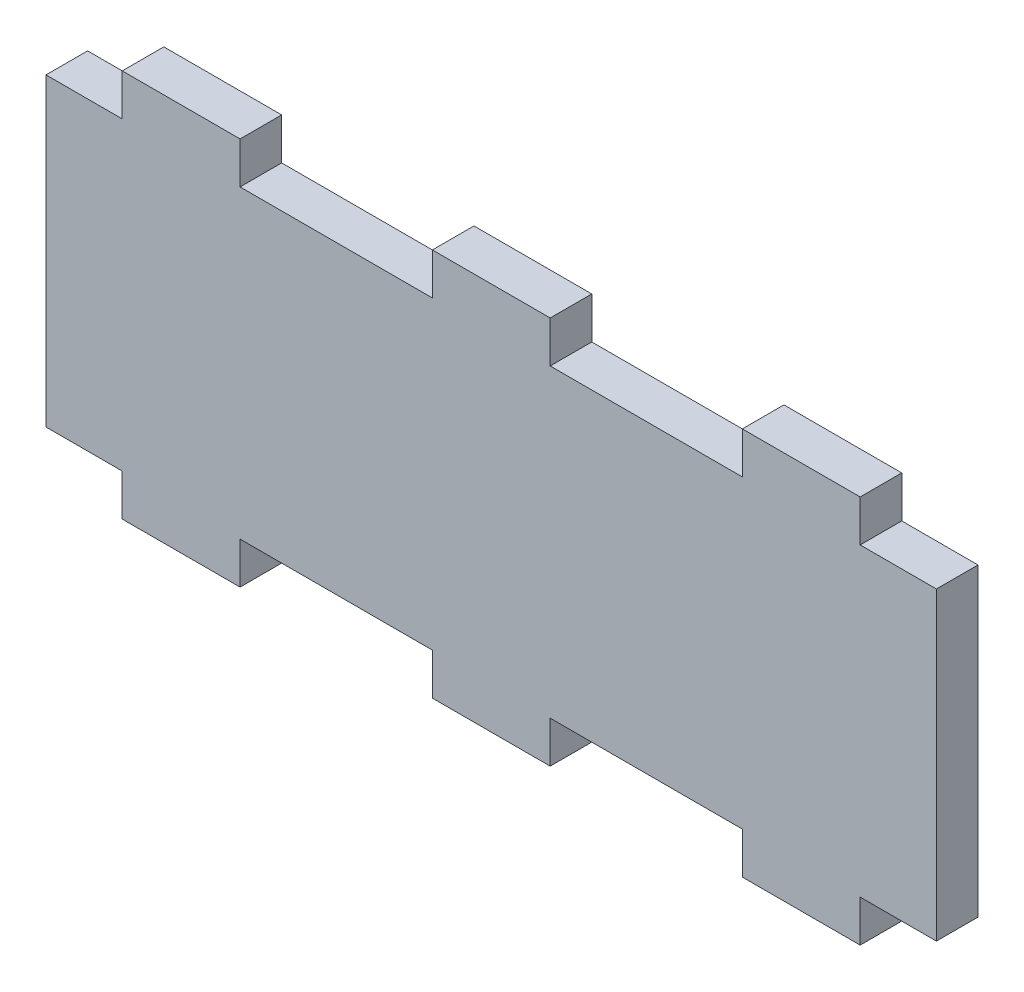
ISO-10303-21;
HEADER;
FILE_DESCRIPTION(('STEP AP214'),'2;1');
FILE_NAME('part.step','',(''),(''),'','','');
FILE_SCHEMA(('AUTOMOTIVE_DESIGN { 1 0 10303 214 1 1 1 1 }'));
ENDSEC;
DATA;
#1=APPLICATION_CONTEXT('core data for automotive mechanical design processes');
#2=APPLICATION_PROTOCOL_DEFINITION('international standard','automotive_design',2000,#1);
#3=PRODUCT_CONTEXT('',#1,'mechanical');
#4=PRODUCT('Part','Part','',(#3));
#5=PRODUCT_RELATED_PRODUCT_CATEGORY('part','',(#4));
#6=PRODUCT_DEFINITION_FORMATION('','',#4);
#7=PRODUCT_DEFINITION_CONTEXT('part definition',#1,'design');
#8=PRODUCT_DEFINITION('design','',#6,#7);
#9=PRODUCT_DEFINITION_SHAPE('','',#8);
#10=(LENGTH_UNIT() NAMED_UNIT(*) SI_UNIT(.MILLI.,.METRE.));
#11=(NAMED_UNIT(*) PLANE_ANGLE_UNIT() SI_UNIT($,.RADIAN.));
#12=(NAMED_UNIT(*) SI_UNIT($,.STERADIAN.) SOLID_ANGLE_UNIT());
#13=UNCERTAINTY_MEASURE_WITH_UNIT(LENGTH_MEASURE(1.E-05),#10,'distance_accuracy_value','');
#14=(GEOMETRIC_REPRESENTATION_CONTEXT(3) GLOBAL_UNCERTAINTY_ASSIGNED_CONTEXT((#13)) GLOBAL_UNIT_ASSIGNED_CONTEXT((#10,
#11,#12)) REPRESENTATION_CONTEXT('',''));
#15=CARTESIAN_POINT('',(0.,0.,0.));
#16=DIRECTION('',(0.,0.,1.));
#17=DIRECTION('',(1.,0.,0.));
#18=AXIS2_PLACEMENT_3D('',#15,#16,#17);
#19=CARTESIAN_POINT('',(8.5,0.,3.));
#20=DIRECTION('',(1.,0.,0.));
#21=DIRECTION('',(0.,0.,-1.));
#22=AXIS2_PLACEMENT_3D('',#19,#20,#21);
#23=PLANE('',#22);
#24=DIRECTION('',(0.,-1.,0.));
#25=VECTOR('',#24,1.);
#26=CARTESIAN_POINT('',(8.5,0.,0.));
#27=LINE('',#26,#25);
#28=CARTESIAN_POINT('',(8.5,0.,0.));
#29=VERTEX_POINT('',#28);
#30=CARTESIAN_POINT('',(8.5,-3.,0.));
#31=VERTEX_POINT('',#30);
#32=EDGE_CURVE('E260',#29,#31,#27,.T.);
#33=ORIENTED_EDGE('',*,*,#32,.T.);
#34=DIRECTION('',(0.,0.,-1.));
#35=VECTOR('',#34,1.);
#36=CARTESIAN_POINT('',(8.5,-3.,3.));
#37=LINE('',#36,#35);
#38=CARTESIAN_POINT('',(8.5,-3.,3.));
#39=VERTEX_POINT('',#38);
#40=EDGE_CURVE('E11',#39,#31,#37,.T.);
#41=ORIENTED_EDGE('',*,*,#40,.F.);
#42=DIRECTION('',(0.,-1.,0.));
#43=VECTOR('',#42,1.);
#44=CARTESIAN_POINT('',(8.5,0.,3.));
#45=LINE('',#44,#43);
#46=CARTESIAN_POINT('',(8.5,0.,3.));
#47=VERTEX_POINT('',#46);
#48=EDGE_CURVE('E342',#47,#39,#45,.T.);
#49=ORIENTED_EDGE('',*,*,#48,.F.);
#50=DIRECTION('',(0.,0.,-1.));
#51=VECTOR('',#50,1.);
#52=CARTESIAN_POINT('',(8.5,0.,3.));
#53=LINE('',#52,#51);
#54=EDGE_CURVE('E256',#47,#29,#53,.T.);
#55=ORIENTED_EDGE('',*,*,#54,.T.);
#56=EDGE_LOOP('',(#33,#41,#49,#55));
#57=FACE_BOUND('',#56,.T.);
#58=ADVANCED_FACE('F39',(#57),#23,.F.);
#59=CARTESIAN_POINT('',(8.5,-3.,3.));
#60=DIRECTION('',(0.,1.,0.));
#61=DIRECTION('',(-1.,0.,0.));
#62=AXIS2_PLACEMENT_3D('',#59,#60,#61);
#63=PLANE('',#62);
#64=DIRECTION('',(1.,0.,0.));
#65=VECTOR('',#64,1.);
#66=CARTESIAN_POINT('',(8.5,-3.,0.));
#67=LINE('',#66,#65);
#68=CARTESIAN_POINT('',(17.,-3.,0.));
#69=VERTEX_POINT('',#68);
#70=EDGE_CURVE('E264',#31,#69,#67,.T.);
#71=ORIENTED_EDGE('',*,*,#70,.T.);
#72=DIRECTION('',(0.,0.,-1.));
#73=VECTOR('',#72,1.);
#74=CARTESIAN_POINT('',(17.,-3.,3.));
#75=LINE('',#74,#73);
#76=CARTESIAN_POINT('',(17.,-3.,3.));
#77=VERTEX_POINT('',#76);
#78=EDGE_CURVE('E48',#77,#69,#75,.T.);
#79=ORIENTED_EDGE('',*,*,#78,.F.);
#80=DIRECTION('',(1.,0.,0.));
#81=VECTOR('',#80,1.);
#82=CARTESIAN_POINT('',(8.5,-3.,3.));
#83=LINE('',#82,#81);
#84=EDGE_CURVE('E159',#39,#77,#83,.T.);
#85=ORIENTED_EDGE('',*,*,#84,.F.);
#86=ORIENTED_EDGE('',*,*,#40,.T.);
#87=EDGE_LOOP('',(#71,#79,#85,#86));
#88=FACE_BOUND('',#87,.T.);
#89=ADVANCED_FACE('F548',(#88),#63,.F.);
#90=CARTESIAN_POINT('',(17.,0.,3.));
#91=DIRECTION('',(-1.,0.,0.));
#92=DIRECTION('',(0.,0.,1.));
#93=AXIS2_PLACEMENT_3D('',#90,#91,#92);
#94=PLANE('',#93);
#95=DIRECTION('',(0.,1.,0.));
#96=VECTOR('',#95,1.);
#97=CARTESIAN_POINT('',(17.,0.,0.));
#98=LINE('',#97,#96);
#99=CARTESIAN_POINT('',(17.,0.,0.));
#100=VERTEX_POINT('',#99);
#101=EDGE_CURVE('E267',#69,#100,#98,.T.);
#102=ORIENTED_EDGE('',*,*,#101,.T.);
#103=DIRECTION('',(0.,0.,-1.));
#104=VECTOR('',#103,1.);
#105=CARTESIAN_POINT('',(17.,0.,3.));
#106=LINE('',#105,#104);
#107=CARTESIAN_POINT('',(17.,0.,3.));
#108=VERTEX_POINT('',#107);
#109=EDGE_CURVE('E433',#108,#100,#106,.T.);
#110=ORIENTED_EDGE('',*,*,#109,.F.);
#111=DIRECTION('',(0.,1.,0.));
#112=VECTOR('',#111,1.);
#113=CARTESIAN_POINT('',(17.,0.,3.));
#114=LINE('',#113,#112);
#115=EDGE_CURVE('E443',#77,#108,#114,.T.);
#116=ORIENTED_EDGE('',*,*,#115,.F.);
#117=ORIENTED_EDGE('',*,*,#78,.T.);
#118=EDGE_LOOP('',(#102,#110,#116,#117));
#119=FACE_BOUND('',#118,.T.);
#120=ADVANCED_FACE('F441',(#119),#94,.F.);
#121=CARTESIAN_POINT('',(17.,0.,3.));
#122=DIRECTION('',(0.,1.,0.));
#123=DIRECTION('',(0.,0.,1.));
#124=AXIS2_PLACEMENT_3D('',#121,#122,#123);
#125=PLANE('',#124);
#126=DIRECTION('',(1.,0.,0.));
#127=VECTOR('',#126,1.);
#128=CARTESIAN_POINT('',(17.,0.,0.));
#129=LINE('',#128,#127);
#130=CARTESIAN_POINT('',(30.87,0.,0.));
#131=VERTEX_POINT('',#130);
#132=EDGE_CURVE('E270',#100,#131,#129,.T.);
#133=ORIENTED_EDGE('',*,*,#132,.T.);
#134=DIRECTION('',(0.,0.,-1.));
#135=VECTOR('',#134,1.);
#136=CARTESIAN_POINT('',(30.87,0.,3.));
#137=LINE('',#136,#135);
#138=CARTESIAN_POINT('',(30.87,0.,3.));
#139=VERTEX_POINT('',#138);
#140=EDGE_CURVE('E429',#139,#131,#137,.T.);
#141=ORIENTED_EDGE('',*,*,#140,.F.);
#142=DIRECTION('',(1.,0.,0.));
#143=VECTOR('',#142,1.);
#144=CARTESIAN_POINT('',(17.,0.,3.));
#145=LINE('',#144,#143);
#146=EDGE_CURVE('E462',#108,#139,#145,.T.);
#147=ORIENTED_EDGE('',*,*,#146,.F.);
#148=ORIENTED_EDGE('',*,*,#109,.T.);
#149=EDGE_LOOP('',(#133,#141,#147,#148));
#150=FACE_BOUND('',#149,.T.);
#151=ADVANCED_FACE('F452',(#150),#125,.F.);
#152=CARTESIAN_POINT('',(30.87,0.,3.));
#153=DIRECTION('',(1.,0.,0.));
#154=DIRECTION('',(0.,0.,-1.));
#155=AXIS2_PLACEMENT_3D('',#152,#153,#154);
#156=PLANE('',#155);
#157=DIRECTION('',(0.,-1.,0.));
#158=VECTOR('',#157,1.);
#159=CARTESIAN_POINT('',(30.87,0.,0.));
#160=LINE('',#159,#158);
#161=CARTESIAN_POINT('',(30.87,-3.,0.));
#162=VERTEX_POINT('',#161);
#163=EDGE_CURVE('E273',#131,#162,#160,.T.);
#164=ORIENTED_EDGE('',*,*,#163,.T.);
#165=DIRECTION('',(0.,0.,-1.));
#166=VECTOR('',#165,1.);
#167=CARTESIAN_POINT('',(30.87,-3.,3.));
#168=LINE('',#167,#166);
#169=CARTESIAN_POINT('',(30.87,-3.,3.));
#170=VERTEX_POINT('',#169);
#171=EDGE_CURVE('E425',#170,#162,#168,.T.);
#172=ORIENTED_EDGE('',*,*,#171,.F.);
#173=DIRECTION('',(0.,-1.,0.));
#174=VECTOR('',#173,1.);
#175=CARTESIAN_POINT('',(30.87,0.,3.));
#176=LINE('',#175,#174);
#177=EDGE_CURVE('E458',#139,#170,#176,.T.);
#178=ORIENTED_EDGE('',*,*,#177,.F.);
#179=ORIENTED_EDGE('',*,*,#140,.T.);
#180=EDGE_LOOP('',(#164,#172,#178,#179));
#181=FACE_BOUND('',#180,.T.);
#182=ADVANCED_FACE('F456',(#181),#156,.F.);
#183=CARTESIAN_POINT('',(30.87,-3.,3.));
#184=DIRECTION('',(0.,1.,0.));
#185=DIRECTION('',(-1.,0.,0.));
#186=AXIS2_PLACEMENT_3D('',#183,#184,#185);
#187=PLANE('',#186);
#188=DIRECTION('',(1.,0.,0.));
#189=VECTOR('',#188,1.);
#190=CARTESIAN_POINT('',(30.87,-3.,0.));
#191=LINE('',#190,#189);
#192=CARTESIAN_POINT('',(39.37,-3.,0.));
#193=VERTEX_POINT('',#192);
#194=EDGE_CURVE('E276',#162,#193,#191,.T.);
#195=ORIENTED_EDGE('',*,*,#194,.T.);
#196=DIRECTION('',(0.,0.,-1.));
#197=VECTOR('',#196,1.);
#198=CARTESIAN_POINT('',(39.37,-3.,3.));
#199=LINE('',#198,#197);
#200=CARTESIAN_POINT('',(39.37,-3.,3.));
#201=VERTEX_POINT('',#200);
#202=EDGE_CURVE('E421',#201,#193,#199,.T.);
#203=ORIENTED_EDGE('',*,*,#202,.F.);
#204=DIRECTION('',(1.,0.,0.));
#205=VECTOR('',#204,1.);
#206=CARTESIAN_POINT('',(30.87,-3.,3.));
#207=LINE('',#206,#205);
#208=EDGE_CURVE('E461',#170,#201,#207,.T.);
#209=ORIENTED_EDGE('',*,*,#208,.F.);
#210=ORIENTED_EDGE('',*,*,#171,.T.);
#211=EDGE_LOOP('',(#195,#203,#209,#210));
#212=FACE_BOUND('',#211,.T.);
#213=ADVANCED_FACE('F561',(#212),#187,.F.);
#214=CARTESIAN_POINT('',(39.37,0.,3.));
#215=DIRECTION('',(-1.,0.,0.));
#216=DIRECTION('',(0.,0.,1.));
#217=AXIS2_PLACEMENT_3D('',#214,#215,#216);
#218=PLANE('',#217);
#219=DIRECTION('',(0.,1.,0.));
#220=VECTOR('',#219,1.);
#221=CARTESIAN_POINT('',(39.37,0.,0.));
#222=LINE('',#221,#220);
#223=CARTESIAN_POINT('',(39.37,0.,0.));
#224=VERTEX_POINT('',#223);
#225=EDGE_CURVE('E279',#193,#224,#222,.T.);
#226=ORIENTED_EDGE('',*,*,#225,.T.);
#227=DIRECTION('',(0.,0.,-1.));
#228=VECTOR('',#227,1.);
#229=CARTESIAN_POINT('',(39.37,0.,3.));
#230=LINE('',#229,#228);
#231=CARTESIAN_POINT('',(39.37,0.,3.));
#232=VERTEX_POINT('',#231);
#233=EDGE_CURVE('E417',#232,#224,#230,.T.);
#234=ORIENTED_EDGE('',*,*,#233,.F.);
#235=DIRECTION('',(0.,1.,0.));
#236=VECTOR('',#235,1.);
#237=CARTESIAN_POINT('',(39.37,0.,3.));
#238=LINE('',#237,#236);
#239=EDGE_CURVE('E466',#201,#232,#238,.T.);
#240=ORIENTED_EDGE('',*,*,#239,.F.);
#241=ORIENTED_EDGE('',*,*,#202,.T.);
#242=EDGE_LOOP('',(#226,#234,#240,#241));
#243=FACE_BOUND('',#242,.T.);
#244=ADVANCED_FACE('F564',(#243),#218,.F.);
#245=CARTESIAN_POINT('',(39.37,0.,3.));
#246=DIRECTION('',(0.,1.,0.));
#247=DIRECTION('',(0.,0.,1.));
#248=AXIS2_PLACEMENT_3D('',#245,#246,#247);
#249=PLANE('',#248);
#250=DIRECTION('',(1.,0.,0.));
#251=VECTOR('',#250,1.);
#252=CARTESIAN_POINT('',(39.37,0.,0.));
#253=LINE('',#252,#251);
#254=CARTESIAN_POINT('',(53.23,0.,0.));
#255=VERTEX_POINT('',#254);
#256=EDGE_CURVE('E282',#224,#255,#253,.T.);
#257=ORIENTED_EDGE('',*,*,#256,.T.);
#258=DIRECTION('',(0.,0.,-1.));
#259=VECTOR('',#258,1.);
#260=CARTESIAN_POINT('',(53.23,0.,3.));
#261=LINE('',#260,#259);
#262=CARTESIAN_POINT('',(53.23,0.,3.));
#263=VERTEX_POINT('',#262);
#264=EDGE_CURVE('E413',#263,#255,#261,.T.);
#265=ORIENTED_EDGE('',*,*,#264,.F.);
#266=DIRECTION('',(1.,0.,0.));
#267=VECTOR('',#266,1.);
#268=CARTESIAN_POINT('',(39.37,0.,3.));
#269=LINE('',#268,#267);
#270=EDGE_CURVE('E473',#232,#263,#269,.T.);
#271=ORIENTED_EDGE('',*,*,#270,.F.);
#272=ORIENTED_EDGE('',*,*,#233,.T.);
#273=EDGE_LOOP('',(#257,#265,#271,#272));
#274=FACE_BOUND('',#273,.T.);
#275=ADVANCED_FACE('F568',(#274),#249,.F.);
#276=CARTESIAN_POINT('',(53.23,0.,3.));
#277=DIRECTION('',(1.,0.,0.));
#278=DIRECTION('',(0.,0.,-1.));
#279=AXIS2_PLACEMENT_3D('',#276,#277,#278);
#280=PLANE('',#279);
#281=DIRECTION('',(0.,-1.,0.));
#282=VECTOR('',#281,1.);
#283=CARTESIAN_POINT('',(53.23,0.,0.));
#284=LINE('',#283,#282);
#285=CARTESIAN_POINT('',(53.23,-3.,0.));
#286=VERTEX_POINT('',#285);
#287=EDGE_CURVE('E285',#255,#286,#284,.T.);
#288=ORIENTED_EDGE('',*,*,#287,.T.);
#289=DIRECTION('',(0.,0.,-1.));
#290=VECTOR('',#289,1.);
#291=CARTESIAN_POINT('',(53.23,-3.,3.));
#292=LINE('',#291,#290);
#293=CARTESIAN_POINT('',(53.23,-3.,3.));
#294=VERTEX_POINT('',#293);
#295=EDGE_CURVE('E409',#294,#286,#292,.T.);
#296=ORIENTED_EDGE('',*,*,#295,.F.);
#297=DIRECTION('',(0.,-1.,0.));
#298=VECTOR('',#297,1.);
#299=CARTESIAN_POINT('',(53.23,0.,3.));
#300=LINE('',#299,#298);
#301=EDGE_CURVE('E476',#263,#294,#300,.T.);
#302=ORIENTED_EDGE('',*,*,#301,.F.);
#303=ORIENTED_EDGE('',*,*,#264,.T.);
#304=EDGE_LOOP('',(#288,#296,#302,#303));
#305=FACE_BOUND('',#304,.T.);
#306=ADVANCED_FACE('F572',(#305),#280,.F.);
#307=CARTESIAN_POINT('',(53.23,-3.,3.));
#308=DIRECTION('',(0.,1.,0.));
#309=DIRECTION('',(0.,0.,1.));
#310=AXIS2_PLACEMENT_3D('',#307,#308,#309);
#311=PLANE('',#310);
#312=DIRECTION('',(1.,0.,0.));
#313=VECTOR('',#312,1.);
#314=CARTESIAN_POINT('',(53.23,-3.,0.));
#315=LINE('',#314,#313);
#316=CARTESIAN_POINT('',(61.73,-3.,0.));
#317=VERTEX_POINT('',#316);
#318=EDGE_CURVE('E288',#286,#317,#315,.T.);
#319=ORIENTED_EDGE('',*,*,#318,.T.);
#320=DIRECTION('',(0.,0.,-1.));
#321=VECTOR('',#320,1.);
#322=CARTESIAN_POINT('',(61.73,-3.,3.));
#323=LINE('',#322,#321);
#324=CARTESIAN_POINT('',(61.73,-3.,3.));
#325=VERTEX_POINT('',#324);
#326=EDGE_CURVE('E405',#325,#317,#323,.T.);
#327=ORIENTED_EDGE('',*,*,#326,.F.);
#328=DIRECTION('',(1.,0.,0.));
#329=VECTOR('',#328,1.);
#330=CARTESIAN_POINT('',(53.23,-3.,3.));
#331=LINE('',#330,#329);
#332=EDGE_CURVE('E479',#294,#325,#331,.T.);
#333=ORIENTED_EDGE('',*,*,#332,.F.);
#334=ORIENTED_EDGE('',*,*,#295,.T.);
#335=EDGE_LOOP('',(#319,#327,#333,#334));
#336=FACE_BOUND('',#335,.T.);
#337=ADVANCED_FACE('F576',(#336),#311,.F.);
#338=CARTESIAN_POINT('',(61.73,0.,3.));
#339=DIRECTION('',(-1.,0.,0.));
#340=DIRECTION('',(0.,0.,1.));
#341=AXIS2_PLACEMENT_3D('',#338,#339,#340);
#342=PLANE('',#341);
#343=DIRECTION('',(0.,1.,0.));
#344=VECTOR('',#343,1.);
#345=CARTESIAN_POINT('',(61.73,0.,0.));
#346=LINE('',#345,#344);
#347=CARTESIAN_POINT('',(61.73,0.,0.));
#348=VERTEX_POINT('',#347);
#349=EDGE_CURVE('E291',#317,#348,#346,.T.);
#350=ORIENTED_EDGE('',*,*,#349,.T.);
#351=DIRECTION('',(0.,0.,-1.));
#352=VECTOR('',#351,1.);
#353=CARTESIAN_POINT('',(61.73,0.,3.));
#354=LINE('',#353,#352);
#355=CARTESIAN_POINT('',(61.73,0.,3.));
#356=VERTEX_POINT('',#355);
#357=EDGE_CURVE('E401',#356,#348,#354,.T.);
#358=ORIENTED_EDGE('',*,*,#357,.F.);
#359=DIRECTION('',(0.,1.,0.));
#360=VECTOR('',#359,1.);
#361=CARTESIAN_POINT('',(61.73,0.,3.));
#362=LINE('',#361,#360);
#363=EDGE_CURVE('E482',#325,#356,#362,.T.);
#364=ORIENTED_EDGE('',*,*,#363,.F.);
#365=ORIENTED_EDGE('',*,*,#326,.T.);
#366=EDGE_LOOP('',(#350,#358,#364,#365));
#367=FACE_BOUND('',#366,.T.);
#368=ADVANCED_FACE('F580',(#367),#342,.F.);
#369=CARTESIAN_POINT('',(61.73,0.,3.));
#370=DIRECTION('',(0.,1.,0.));
#371=DIRECTION('',(0.,0.,1.));
#372=AXIS2_PLACEMENT_3D('',#369,#370,#371);
#373=PLANE('',#372);
#374=DIRECTION('',(1.,0.,0.));
#375=VECTOR('',#374,1.);
#376=CARTESIAN_POINT('',(61.73,0.,0.));
#377=LINE('',#376,#375);
#378=CARTESIAN_POINT('',(67.23,0.,0.));
#379=VERTEX_POINT('',#378);
#380=EDGE_CURVE('E294',#348,#379,#377,.T.);
#381=ORIENTED_EDGE('',*,*,#380,.T.);
#382=DIRECTION('',(0.,0.,-1.));
#383=VECTOR('',#382,1.);
#384=CARTESIAN_POINT('',(67.23,0.,3.));
#385=LINE('',#384,#383);
#386=CARTESIAN_POINT('',(67.23,0.,3.));
#387=VERTEX_POINT('',#386);
#388=EDGE_CURVE('E397',#387,#379,#385,.T.);
#389=ORIENTED_EDGE('',*,*,#388,.F.);
#390=DIRECTION('',(1.,0.,0.));
#391=VECTOR('',#390,1.);
#392=CARTESIAN_POINT('',(61.73,0.,3.));
#393=LINE('',#392,#391);
#394=EDGE_CURVE('E485',#356,#387,#393,.T.);
#395=ORIENTED_EDGE('',*,*,#394,.F.);
#396=ORIENTED_EDGE('',*,*,#357,.T.);
#397=EDGE_LOOP('',(#381,#389,#395,#396));
#398=FACE_BOUND('',#397,.T.);
#399=ADVANCED_FACE('F584',(#398),#373,.F.);
#400=CARTESIAN_POINT('',(67.23,22.,3.));
#401=DIRECTION('',(-1.,0.,0.));
#402=DIRECTION('',(0.,0.,1.));
#403=AXIS2_PLACEMENT_3D('',#400,#401,#402);
#404=PLANE('',#403);
#405=DIRECTION('',(0.,1.,0.));
#406=VECTOR('',#405,1.);
#407=CARTESIAN_POINT('',(67.23,22.,0.));
#408=LINE('',#407,#406);
#409=CARTESIAN_POINT('',(67.23,22.,0.));
#410=VERTEX_POINT('',#409);
#411=EDGE_CURVE('E297',#379,#410,#408,.T.);
#412=ORIENTED_EDGE('',*,*,#411,.T.);
#413=DIRECTION('',(0.,0.,-1.));
#414=VECTOR('',#413,1.);
#415=CARTESIAN_POINT('',(67.23,22.,3.));
#416=LINE('',#415,#414);
#417=CARTESIAN_POINT('',(67.23,22.,3.));
#418=VERTEX_POINT('',#417);
#419=EDGE_CURVE('E393',#418,#410,#416,.T.);
#420=ORIENTED_EDGE('',*,*,#419,.F.);
#421=DIRECTION('',(0.,1.,0.));
#422=VECTOR('',#421,1.);
#423=CARTESIAN_POINT('',(67.23,22.,3.));
#424=LINE('',#423,#422);
#425=EDGE_CURVE('E488',#387,#418,#424,.T.);
#426=ORIENTED_EDGE('',*,*,#425,.F.);
#427=ORIENTED_EDGE('',*,*,#388,.T.);
#428=EDGE_LOOP('',(#412,#420,#426,#427));
#429=FACE_BOUND('',#428,.T.);
#430=ADVANCED_FACE('F588',(#429),#404,.F.);
#431=CARTESIAN_POINT('',(61.73,22.,3.));
#432=DIRECTION('',(0.,-1.,0.));
#433=DIRECTION('',(0.,0.,-1.));
#434=AXIS2_PLACEMENT_3D('',#431,#432,#433);
#435=PLANE('',#434);
#436=DIRECTION('',(-1.,0.,0.));
#437=VECTOR('',#436,1.);
#438=CARTESIAN_POINT('',(61.73,22.,0.));
#439=LINE('',#438,#437);
#440=CARTESIAN_POINT('',(61.73,22.,0.));
#441=VERTEX_POINT('',#440);
#442=EDGE_CURVE('E300',#410,#441,#439,.T.);
#443=ORIENTED_EDGE('',*,*,#442,.T.);
#444=DIRECTION('',(0.,0.,-1.));
#445=VECTOR('',#444,1.);
#446=CARTESIAN_POINT('',(61.73,22.,3.));
#447=LINE('',#446,#445);
#448=CARTESIAN_POINT('',(61.73,22.,3.));
#449=VERTEX_POINT('',#448);
#450=EDGE_CURVE('E389',#449,#441,#447,.T.);
#451=ORIENTED_EDGE('',*,*,#450,.F.);
#452=DIRECTION('',(-1.,0.,0.));
#453=VECTOR('',#452,1.);
#454=CARTESIAN_POINT('',(61.73,22.,3.));
#455=LINE('',#454,#453);
#456=EDGE_CURVE('E491',#418,#449,#455,.T.);
#457=ORIENTED_EDGE('',*,*,#456,.F.);
#458=ORIENTED_EDGE('',*,*,#419,.T.);
#459=EDGE_LOOP('',(#443,#451,#457,#458));
#460=FACE_BOUND('',#459,.T.);
#461=ADVANCED_FACE('F592',(#460),#435,.F.);
#462=CARTESIAN_POINT('',(61.73,22.,3.));
#463=DIRECTION('',(-1.,0.,0.));
#464=DIRECTION('',(0.,0.,1.));
#465=AXIS2_PLACEMENT_3D('',#462,#463,#464);
#466=PLANE('',#465);
#467=DIRECTION('',(0.,1.,0.));
#468=VECTOR('',#467,1.);
#469=CARTESIAN_POINT('',(61.73,22.,0.));
#470=LINE('',#469,#468);
#471=CARTESIAN_POINT('',(61.73,25.,0.));
#472=VERTEX_POINT('',#471);
#473=EDGE_CURVE('E303',#441,#472,#470,.T.);
#474=ORIENTED_EDGE('',*,*,#473,.T.);
#475=DIRECTION('',(0.,0.,-1.));
#476=VECTOR('',#475,1.);
#477=CARTESIAN_POINT('',(61.73,25.,3.));
#478=LINE('',#477,#476);
#479=CARTESIAN_POINT('',(61.73,25.,3.));
#480=VERTEX_POINT('',#479);
#481=EDGE_CURVE('E385',#480,#472,#478,.T.);
#482=ORIENTED_EDGE('',*,*,#481,.F.);
#483=DIRECTION('',(0.,1.,0.));
#484=VECTOR('',#483,1.);
#485=CARTESIAN_POINT('',(61.73,22.,3.));
#486=LINE('',#485,#484);
#487=EDGE_CURVE('E494',#449,#480,#486,.T.);
#488=ORIENTED_EDGE('',*,*,#487,.F.);
#489=ORIENTED_EDGE('',*,*,#450,.T.);
#490=EDGE_LOOP('',(#474,#482,#488,#489));
#491=FACE_BOUND('',#490,.T.);
#492=ADVANCED_FACE('F596',(#491),#466,.F.);
#493=CARTESIAN_POINT('',(53.23,25.,3.));
#494=DIRECTION('',(0.,-1.,0.));
#495=DIRECTION('',(0.,0.,-1.));
#496=AXIS2_PLACEMENT_3D('',#493,#494,#495);
#497=PLANE('',#496);
#498=DIRECTION('',(-1.,0.,0.));
#499=VECTOR('',#498,1.);
#500=CARTESIAN_POINT('',(53.23,25.,0.));
#501=LINE('',#500,#499);
#502=CARTESIAN_POINT('',(53.23,25.,0.));
#503=VERTEX_POINT('',#502);
#504=EDGE_CURVE('E306',#472,#503,#501,.T.);
#505=ORIENTED_EDGE('',*,*,#504,.T.);
#506=DIRECTION('',(0.,0.,-1.));
#507=VECTOR('',#506,1.);
#508=CARTESIAN_POINT('',(53.23,25.,3.));
#509=LINE('',#508,#507);
#510=CARTESIAN_POINT('',(53.23,25.,3.));
#511=VERTEX_POINT('',#510);
#512=EDGE_CURVE('E381',#511,#503,#509,.T.);
#513=ORIENTED_EDGE('',*,*,#512,.F.);
#514=DIRECTION('',(-1.,0.,0.));
#515=VECTOR('',#514,1.);
#516=CARTESIAN_POINT('',(53.23,25.,3.));
#517=LINE('',#516,#515);
#518=EDGE_CURVE('E497',#480,#511,#517,.T.);
#519=ORIENTED_EDGE('',*,*,#518,.F.);
#520=ORIENTED_EDGE('',*,*,#481,.T.);
#521=EDGE_LOOP('',(#505,#513,#519,#520));
#522=FACE_BOUND('',#521,.T.);
#523=ADVANCED_FACE('F600',(#522),#497,.F.);
#524=CARTESIAN_POINT('',(53.23,22.,3.));
#525=DIRECTION('',(1.,0.,0.));
#526=DIRECTION('',(0.,0.,-1.));
#527=AXIS2_PLACEMENT_3D('',#524,#525,#526);
#528=PLANE('',#527);
#529=DIRECTION('',(0.,-1.,0.));
#530=VECTOR('',#529,1.);
#531=CARTESIAN_POINT('',(53.23,22.,0.));
#532=LINE('',#531,#530);
#533=CARTESIAN_POINT('',(53.23,22.,0.));
#534=VERTEX_POINT('',#533);
#535=EDGE_CURVE('E309',#503,#534,#532,.T.);
#536=ORIENTED_EDGE('',*,*,#535,.T.);
#537=DIRECTION('',(0.,0.,-1.));
#538=VECTOR('',#537,1.);
#539=CARTESIAN_POINT('',(53.23,22.,3.));
#540=LINE('',#539,#538);
#541=CARTESIAN_POINT('',(53.23,22.,3.));
#542=VERTEX_POINT('',#541);
#543=EDGE_CURVE('E377',#542,#534,#540,.T.);
#544=ORIENTED_EDGE('',*,*,#543,.F.);
#545=DIRECTION('',(0.,-1.,0.));
#546=VECTOR('',#545,1.);
#547=CARTESIAN_POINT('',(53.23,22.,3.));
#548=LINE('',#547,#546);
#549=EDGE_CURVE('E500',#511,#542,#548,.T.);
#550=ORIENTED_EDGE('',*,*,#549,.F.);
#551=ORIENTED_EDGE('',*,*,#512,.T.);
#552=EDGE_LOOP('',(#536,#544,#550,#551));
#553=FACE_BOUND('',#552,.T.);
#554=ADVANCED_FACE('F604',(#553),#528,.F.);
#555=CARTESIAN_POINT('',(39.37,22.,3.));
#556=DIRECTION('',(0.,-1.,0.));
#557=DIRECTION('',(0.,0.,-1.));
#558=AXIS2_PLACEMENT_3D('',#555,#556,#557);
#559=PLANE('',#558);
#560=DIRECTION('',(-1.,0.,0.));
#561=VECTOR('',#560,1.);
#562=CARTESIAN_POINT('',(39.37,22.,0.));
#563=LINE('',#562,#561);
#564=CARTESIAN_POINT('',(39.37,22.,0.));
#565=VERTEX_POINT('',#564);
#566=EDGE_CURVE('E312',#534,#565,#563,.T.);
#567=ORIENTED_EDGE('',*,*,#566,.T.);
#568=DIRECTION('',(0.,0.,-1.));
#569=VECTOR('',#568,1.);
#570=CARTESIAN_POINT('',(39.37,22.,3.));
#571=LINE('',#570,#569);
#572=CARTESIAN_POINT('',(39.37,22.,3.));
#573=VERTEX_POINT('',#572);
#574=EDGE_CURVE('E373',#573,#565,#571,.T.);
#575=ORIENTED_EDGE('',*,*,#574,.F.);
#576=DIRECTION('',(-1.,0.,0.));
#577=VECTOR('',#576,1.);
#578=CARTESIAN_POINT('',(39.37,22.,3.));
#579=LINE('',#578,#577);
#580=EDGE_CURVE('E503',#542,#573,#579,.T.);
#581=ORIENTED_EDGE('',*,*,#580,.F.);
#582=ORIENTED_EDGE('',*,*,#543,.T.);
#583=EDGE_LOOP('',(#567,#575,#581,#582));
#584=FACE_BOUND('',#583,.T.);
#585=ADVANCED_FACE('F608',(#584),#559,.F.);
#586=CARTESIAN_POINT('',(39.37,22.,3.));
#587=DIRECTION('',(-1.,0.,0.));
#588=DIRECTION('',(0.,0.,1.));
#589=AXIS2_PLACEMENT_3D('',#586,#587,#588);
#590=PLANE('',#589);
#591=DIRECTION('',(0.,1.,0.));
#592=VECTOR('',#591,1.);
#593=CARTESIAN_POINT('',(39.37,22.,0.));
#594=LINE('',#593,#592);
#595=CARTESIAN_POINT('',(39.37,25.,0.));
#596=VERTEX_POINT('',#595);
#597=EDGE_CURVE('E315',#565,#596,#594,.T.);
#598=ORIENTED_EDGE('',*,*,#597,.T.);
#599=DIRECTION('',(0.,0.,-1.));
#600=VECTOR('',#599,1.);
#601=CARTESIAN_POINT('',(39.37,25.,3.));
#602=LINE('',#601,#600);
#603=CARTESIAN_POINT('',(39.37,25.,3.));
#604=VERTEX_POINT('',#603);
#605=EDGE_CURVE('E369',#604,#596,#602,.T.);
#606=ORIENTED_EDGE('',*,*,#605,.F.);
#607=DIRECTION('',(0.,1.,0.));
#608=VECTOR('',#607,1.);
#609=CARTESIAN_POINT('',(39.37,22.,3.));
#610=LINE('',#609,#608);
#611=EDGE_CURVE('E506',#573,#604,#610,.T.);
#612=ORIENTED_EDGE('',*,*,#611,.F.);
#613=ORIENTED_EDGE('',*,*,#574,.T.);
#614=EDGE_LOOP('',(#598,#606,#612,#613));
#615=FACE_BOUND('',#614,.T.);
#616=ADVANCED_FACE('F612',(#615),#590,.F.);
#617=CARTESIAN_POINT('',(30.87,25.,3.));
#618=DIRECTION('',(0.,-1.,0.));
#619=DIRECTION('',(1.,0.,0.));
#620=AXIS2_PLACEMENT_3D('',#617,#618,#619);
#621=PLANE('',#620);
#622=DIRECTION('',(-1.,0.,0.));
#623=VECTOR('',#622,1.);
#624=CARTESIAN_POINT('',(30.87,25.,0.));
#625=LINE('',#624,#623);
#626=CARTESIAN_POINT('',(30.87,25.,0.));
#627=VERTEX_POINT('',#626);
#628=EDGE_CURVE('E318',#596,#627,#625,.T.);
#629=ORIENTED_EDGE('',*,*,#628,.T.);
#630=DIRECTION('',(0.,0.,-1.));
#631=VECTOR('',#630,1.);
#632=CARTESIAN_POINT('',(30.87,25.,3.));
#633=LINE('',#632,#631);
#634=CARTESIAN_POINT('',(30.87,25.,3.));
#635=VERTEX_POINT('',#634);
#636=EDGE_CURVE('E365',#635,#627,#633,.T.);
#637=ORIENTED_EDGE('',*,*,#636,.F.);
#638=DIRECTION('',(-1.,0.,0.));
#639=VECTOR('',#638,1.);
#640=CARTESIAN_POINT('',(30.87,25.,3.));
#641=LINE('',#640,#639);
#642=EDGE_CURVE('E509',#604,#635,#641,.T.);
#643=ORIENTED_EDGE('',*,*,#642,.F.);
#644=ORIENTED_EDGE('',*,*,#605,.T.);
#645=EDGE_LOOP('',(#629,#637,#643,#644));
#646=FACE_BOUND('',#645,.T.);
#647=ADVANCED_FACE('F616',(#646),#621,.F.);
#648=CARTESIAN_POINT('',(30.87,22.,3.));
#649=DIRECTION('',(1.,0.,0.));
#650=DIRECTION('',(0.,0.,-1.));
#651=AXIS2_PLACEMENT_3D('',#648,#649,#650);
#652=PLANE('',#651);
#653=DIRECTION('',(0.,-1.,0.));
#654=VECTOR('',#653,1.);
#655=CARTESIAN_POINT('',(30.87,22.,0.));
#656=LINE('',#655,#654);
#657=CARTESIAN_POINT('',(30.87,22.,0.));
#658=VERTEX_POINT('',#657);
#659=EDGE_CURVE('E321',#627,#658,#656,.T.);
#660=ORIENTED_EDGE('',*,*,#659,.T.);
#661=DIRECTION('',(0.,0.,-1.));
#662=VECTOR('',#661,1.);
#663=CARTESIAN_POINT('',(30.87,22.,3.));
#664=LINE('',#663,#662);
#665=CARTESIAN_POINT('',(30.87,22.,3.));
#666=VERTEX_POINT('',#665);
#667=EDGE_CURVE('E361',#666,#658,#664,.T.);
#668=ORIENTED_EDGE('',*,*,#667,.F.);
#669=DIRECTION('',(0.,-1.,0.));
#670=VECTOR('',#669,1.);
#671=CARTESIAN_POINT('',(30.87,22.,3.));
#672=LINE('',#671,#670);
#673=EDGE_CURVE('E512',#635,#666,#672,.T.);
#674=ORIENTED_EDGE('',*,*,#673,.F.);
#675=ORIENTED_EDGE('',*,*,#636,.T.);
#676=EDGE_LOOP('',(#660,#668,#674,#675));
#677=FACE_BOUND('',#676,.T.);
#678=ADVANCED_FACE('F620',(#677),#652,.F.);
#679=CARTESIAN_POINT('',(17.,22.,3.));
#680=DIRECTION('',(0.,-1.,0.));
#681=DIRECTION('',(0.,0.,-1.));
#682=AXIS2_PLACEMENT_3D('',#679,#680,#681);
#683=PLANE('',#682);
#684=DIRECTION('',(-1.,0.,0.));
#685=VECTOR('',#684,1.);
#686=CARTESIAN_POINT('',(17.,22.,0.));
#687=LINE('',#686,#685);
#688=CARTESIAN_POINT('',(17.,22.,0.));
#689=VERTEX_POINT('',#688);
#690=EDGE_CURVE('E324',#658,#689,#687,.T.);
#691=ORIENTED_EDGE('',*,*,#690,.T.);
#692=DIRECTION('',(0.,0.,-1.));
#693=VECTOR('',#692,1.);
#694=CARTESIAN_POINT('',(17.,22.,3.));
#695=LINE('',#694,#693);
#696=CARTESIAN_POINT('',(17.,22.,3.));
#697=VERTEX_POINT('',#696);
#698=EDGE_CURVE('E357',#697,#689,#695,.T.);
#699=ORIENTED_EDGE('',*,*,#698,.F.);
#700=DIRECTION('',(-1.,0.,0.));
#701=VECTOR('',#700,1.);
#702=CARTESIAN_POINT('',(17.,22.,3.));
#703=LINE('',#702,#701);
#704=EDGE_CURVE('E515',#666,#697,#703,.T.);
#705=ORIENTED_EDGE('',*,*,#704,.F.);
#706=ORIENTED_EDGE('',*,*,#667,.T.);
#707=EDGE_LOOP('',(#691,#699,#705,#706));
#708=FACE_BOUND('',#707,.T.);
#709=ADVANCED_FACE('F624',(#708),#683,.F.);
#710=CARTESIAN_POINT('',(17.,22.,3.));
#711=DIRECTION('',(-1.,0.,0.));
#712=DIRECTION('',(0.,0.,1.));
#713=AXIS2_PLACEMENT_3D('',#710,#711,#712);
#714=PLANE('',#713);
#715=DIRECTION('',(0.,1.,0.));
#716=VECTOR('',#715,1.);
#717=CARTESIAN_POINT('',(17.,22.,0.));
#718=LINE('',#717,#716);
#719=CARTESIAN_POINT('',(17.,25.,0.));
#720=VERTEX_POINT('',#719);
#721=EDGE_CURVE('E327',#689,#720,#718,.T.);
#722=ORIENTED_EDGE('',*,*,#721,.T.);
#723=DIRECTION('',(0.,0.,-1.));
#724=VECTOR('',#723,1.);
#725=CARTESIAN_POINT('',(17.,25.,3.));
#726=LINE('',#725,#724);
#727=CARTESIAN_POINT('',(17.,25.,3.));
#728=VERTEX_POINT('',#727);
#729=EDGE_CURVE('E353',#728,#720,#726,.T.);
#730=ORIENTED_EDGE('',*,*,#729,.F.);
#731=DIRECTION('',(0.,1.,0.));
#732=VECTOR('',#731,1.);
#733=CARTESIAN_POINT('',(17.,22.,3.));
#734=LINE('',#733,#732);
#735=EDGE_CURVE('E518',#697,#728,#734,.T.);
#736=ORIENTED_EDGE('',*,*,#735,.F.);
#737=ORIENTED_EDGE('',*,*,#698,.T.);
#738=EDGE_LOOP('',(#722,#730,#736,#737));
#739=FACE_BOUND('',#738,.T.);
#740=ADVANCED_FACE('F628',(#739),#714,.F.);
#741=CARTESIAN_POINT('',(8.5,25.,3.));
#742=DIRECTION('',(0.,-1.,0.));
#743=DIRECTION('',(1.,0.,0.));
#744=AXIS2_PLACEMENT_3D('',#741,#742,#743);
#745=PLANE('',#744);
#746=DIRECTION('',(-1.,0.,0.));
#747=VECTOR('',#746,1.);
#748=CARTESIAN_POINT('',(8.5,25.,0.));
#749=LINE('',#748,#747);
#750=CARTESIAN_POINT('',(8.5,25.,0.));
#751=VERTEX_POINT('',#750);
#752=EDGE_CURVE('E330',#720,#751,#749,.T.);
#753=ORIENTED_EDGE('',*,*,#752,.T.);
#754=DIRECTION('',(0.,0.,-1.));
#755=VECTOR('',#754,1.);
#756=CARTESIAN_POINT('',(8.5,25.,3.));
#757=LINE('',#756,#755);
#758=CARTESIAN_POINT('',(8.5,25.,3.));
#759=VERTEX_POINT('',#758);
#760=EDGE_CURVE('E349',#759,#751,#757,.T.);
#761=ORIENTED_EDGE('',*,*,#760,.F.);
#762=DIRECTION('',(-1.,0.,0.));
#763=VECTOR('',#762,1.);
#764=CARTESIAN_POINT('',(8.5,25.,3.));
#765=LINE('',#764,#763);
#766=EDGE_CURVE('E521',#728,#759,#765,.T.);
#767=ORIENTED_EDGE('',*,*,#766,.F.);
#768=ORIENTED_EDGE('',*,*,#729,.T.);
#769=EDGE_LOOP('',(#753,#761,#767,#768));
#770=FACE_BOUND('',#769,.T.);
#771=ADVANCED_FACE('F529',(#770),#745,.F.);
#772=CARTESIAN_POINT('',(8.5,22.,3.));
#773=DIRECTION('',(1.,0.,0.));
#774=DIRECTION('',(0.,0.,-1.));
#775=AXIS2_PLACEMENT_3D('',#772,#773,#774);
#776=PLANE('',#775);
#777=DIRECTION('',(0.,-1.,0.));
#778=VECTOR('',#777,1.);
#779=CARTESIAN_POINT('',(8.5,22.,0.));
#780=LINE('',#779,#778);
#781=CARTESIAN_POINT('',(8.5,22.,0.));
#782=VERTEX_POINT('',#781);
#783=EDGE_CURVE('E333',#751,#782,#780,.T.);
#784=ORIENTED_EDGE('',*,*,#783,.T.);
#785=DIRECTION('',(0.,0.,-1.));
#786=VECTOR('',#785,1.);
#787=CARTESIAN_POINT('',(8.5,22.,3.));
#788=LINE('',#787,#786);
#789=CARTESIAN_POINT('',(8.5,22.,3.));
#790=VERTEX_POINT('',#789);
#791=EDGE_CURVE('E249',#790,#782,#788,.T.);
#792=ORIENTED_EDGE('',*,*,#791,.F.);
#793=DIRECTION('',(0.,-1.,0.));
#794=VECTOR('',#793,1.);
#795=CARTESIAN_POINT('',(8.5,22.,3.));
#796=LINE('',#795,#794);
#797=EDGE_CURVE('E238',#759,#790,#796,.T.);
#798=ORIENTED_EDGE('',*,*,#797,.F.);
#799=ORIENTED_EDGE('',*,*,#760,.T.);
#800=EDGE_LOOP('',(#784,#792,#798,#799));
#801=FACE_BOUND('',#800,.T.);
#802=ADVANCED_FACE('F533',(#801),#776,.F.);
#803=CARTESIAN_POINT('',(3.,22.,3.));
#804=DIRECTION('',(0.,-1.,0.));
#805=DIRECTION('',(0.,0.,-1.));
#806=AXIS2_PLACEMENT_3D('',#803,#804,#805);
#807=PLANE('',#806);
#808=DIRECTION('',(-1.,0.,0.));
#809=VECTOR('',#808,1.);
#810=CARTESIAN_POINT('',(3.,22.,0.));
#811=LINE('',#810,#809);
#812=CARTESIAN_POINT('',(3.,22.,0.));
#813=VERTEX_POINT('',#812);
#814=EDGE_CURVE('E247',#782,#813,#811,.T.);
#815=ORIENTED_EDGE('',*,*,#814,.T.);
#816=DIRECTION('',(0.,0.,-1.));
#817=VECTOR('',#816,1.);
#818=CARTESIAN_POINT('',(3.,22.,3.));
#819=LINE('',#818,#817);
#820=CARTESIAN_POINT('',(3.,22.,3.));
#821=VERTEX_POINT('',#820);
#822=EDGE_CURVE('E244',#821,#813,#819,.T.);
#823=ORIENTED_EDGE('',*,*,#822,.F.);
#824=DIRECTION('',(-1.,0.,0.));
#825=VECTOR('',#824,1.);
#826=CARTESIAN_POINT('',(3.,22.,3.));
#827=LINE('',#826,#825);
#828=EDGE_CURVE('E232',#790,#821,#827,.T.);
#829=ORIENTED_EDGE('',*,*,#828,.F.);
#830=ORIENTED_EDGE('',*,*,#791,.T.);
#831=EDGE_LOOP('',(#815,#823,#829,#830));
#832=FACE_BOUND('',#831,.T.);
#833=ADVANCED_FACE('F245',(#832),#807,.F.);
#834=CARTESIAN_POINT('',(3.,22.,3.));
#835=DIRECTION('',(1.,0.,0.));
#836=DIRECTION('',(0.,0.,-1.));
#837=AXIS2_PLACEMENT_3D('',#834,#835,#836);
#838=PLANE('',#837);
#839=DIRECTION('',(0.,-1.,0.));
#840=VECTOR('',#839,1.);
#841=CARTESIAN_POINT('',(3.,22.,0.));
#842=LINE('',#841,#840);
#843=CARTESIAN_POINT('',(3.,0.,0.));
#844=VERTEX_POINT('',#843);
#845=EDGE_CURVE('E145',#813,#844,#842,.T.);
#846=ORIENTED_EDGE('',*,*,#845,.T.);
#847=DIRECTION('',(0.,0.,-1.));
#848=VECTOR('',#847,1.);
#849=CARTESIAN_POINT('',(3.,0.,3.));
#850=LINE('',#849,#848);
#851=CARTESIAN_POINT('',(3.,0.,3.));
#852=VERTEX_POINT('',#851);
#853=EDGE_CURVE('E250',#852,#844,#850,.T.);
#854=ORIENTED_EDGE('',*,*,#853,.F.);
#855=DIRECTION('',(0.,-1.,0.));
#856=VECTOR('',#855,1.);
#857=CARTESIAN_POINT('',(3.,22.,3.));
#858=LINE('',#857,#856);
#859=EDGE_CURVE('E236',#821,#852,#858,.T.);
#860=ORIENTED_EDGE('',*,*,#859,.F.);
#861=ORIENTED_EDGE('',*,*,#822,.T.);
#862=EDGE_LOOP('',(#846,#854,#860,#861));
#863=FACE_BOUND('',#862,.T.);
#864=ADVANCED_FACE('F252',(#863),#838,.F.);
#865=CARTESIAN_POINT('',(3.,0.,3.));
#866=DIRECTION('',(0.,1.,0.));
#867=DIRECTION('',(-1.,0.,0.));
#868=AXIS2_PLACEMENT_3D('',#865,#866,#867);
#869=PLANE('',#868);
#870=DIRECTION('',(1.,0.,0.));
#871=VECTOR('',#870,1.);
#872=CARTESIAN_POINT('',(3.,0.,0.));
#873=LINE('',#872,#871);
#874=EDGE_CURVE('E151',#844,#29,#873,.T.);
#875=ORIENTED_EDGE('',*,*,#874,.T.);
#876=ORIENTED_EDGE('',*,*,#54,.F.);
#877=DIRECTION('',(1.,0.,0.));
#878=VECTOR('',#877,1.);
#879=CARTESIAN_POINT('',(3.,0.,3.));
#880=LINE('',#879,#878);
#881=EDGE_CURVE('E56',#852,#47,#880,.T.);
#882=ORIENTED_EDGE('',*,*,#881,.F.);
#883=ORIENTED_EDGE('',*,*,#853,.T.);
#884=EDGE_LOOP('',(#875,#876,#882,#883));
#885=FACE_BOUND('',#884,.T.);
#886=ADVANCED_FACE('F537',(#885),#869,.F.);
#887=CARTESIAN_POINT('',(0.,0.,3.));
#888=DIRECTION('',(0.,0.,1.));
#889=DIRECTION('',(1.,0.,0.));
#890=AXIS2_PLACEMENT_3D('',#887,#888,#889);
#891=PLANE('',#890);
#892=ORIENTED_EDGE('',*,*,#48,.T.);
#893=ORIENTED_EDGE('',*,*,#84,.T.);
#894=ORIENTED_EDGE('',*,*,#115,.T.);
#895=ORIENTED_EDGE('',*,*,#146,.T.);
#896=ORIENTED_EDGE('',*,*,#177,.T.);
#897=ORIENTED_EDGE('',*,*,#208,.T.);
#898=ORIENTED_EDGE('',*,*,#239,.T.);
#899=ORIENTED_EDGE('',*,*,#270,.T.);
#900=ORIENTED_EDGE('',*,*,#301,.T.);
#901=ORIENTED_EDGE('',*,*,#332,.T.);
#902=ORIENTED_EDGE('',*,*,#363,.T.);
#903=ORIENTED_EDGE('',*,*,#394,.T.);
#904=ORIENTED_EDGE('',*,*,#425,.T.);
#905=ORIENTED_EDGE('',*,*,#456,.T.);
#906=ORIENTED_EDGE('',*,*,#487,.T.);
#907=ORIENTED_EDGE('',*,*,#518,.T.);
#908=ORIENTED_EDGE('',*,*,#549,.T.);
#909=ORIENTED_EDGE('',*,*,#580,.T.);
#910=ORIENTED_EDGE('',*,*,#611,.T.);
#911=ORIENTED_EDGE('',*,*,#642,.T.);
#912=ORIENTED_EDGE('',*,*,#673,.T.);
#913=ORIENTED_EDGE('',*,*,#704,.T.);
#914=ORIENTED_EDGE('',*,*,#735,.T.);
#915=ORIENTED_EDGE('',*,*,#766,.T.);
#916=ORIENTED_EDGE('',*,*,#797,.T.);
#917=ORIENTED_EDGE('',*,*,#828,.T.);
#918=ORIENTED_EDGE('',*,*,#859,.T.);
#919=ORIENTED_EDGE('',*,*,#881,.T.);
#920=EDGE_LOOP('',(#892,#893,#894,#895,#896,#897,#898,#899,#900,#901,#902,#903,#904,#905,#906,
#907,#908,#909,#910,#911,#912,#913,#914,#915,#916,#917,#918,#919));
#921=FACE_BOUND('',#920,.T.);
#922=ADVANCED_FACE('F234',(#921),#891,.T.);
#923=CARTESIAN_POINT('',(0.,0.,0.));
#924=DIRECTION('',(0.,0.,1.));
#925=DIRECTION('',(1.,0.,0.));
#926=AXIS2_PLACEMENT_3D('',#923,#924,#925);
#927=PLANE('',#926);
#928=ORIENTED_EDGE('',*,*,#32,.F.);
#929=ORIENTED_EDGE('',*,*,#874,.F.);
#930=ORIENTED_EDGE('',*,*,#845,.F.);
#931=ORIENTED_EDGE('',*,*,#814,.F.);
#932=ORIENTED_EDGE('',*,*,#783,.F.);
#933=ORIENTED_EDGE('',*,*,#752,.F.);
#934=ORIENTED_EDGE('',*,*,#721,.F.);
#935=ORIENTED_EDGE('',*,*,#690,.F.);
#936=ORIENTED_EDGE('',*,*,#659,.F.);
#937=ORIENTED_EDGE('',*,*,#628,.F.);
#938=ORIENTED_EDGE('',*,*,#597,.F.);
#939=ORIENTED_EDGE('',*,*,#566,.F.);
#940=ORIENTED_EDGE('',*,*,#535,.F.);
#941=ORIENTED_EDGE('',*,*,#504,.F.);
#942=ORIENTED_EDGE('',*,*,#473,.F.);
#943=ORIENTED_EDGE('',*,*,#442,.F.);
#944=ORIENTED_EDGE('',*,*,#411,.F.);
#945=ORIENTED_EDGE('',*,*,#380,.F.);
#946=ORIENTED_EDGE('',*,*,#349,.F.);
#947=ORIENTED_EDGE('',*,*,#318,.F.);
#948=ORIENTED_EDGE('',*,*,#287,.F.);
#949=ORIENTED_EDGE('',*,*,#256,.F.);
#950=ORIENTED_EDGE('',*,*,#225,.F.);
#951=ORIENTED_EDGE('',*,*,#194,.F.);
#952=ORIENTED_EDGE('',*,*,#163,.F.);
#953=ORIENTED_EDGE('',*,*,#132,.F.);
#954=ORIENTED_EDGE('',*,*,#101,.F.);
#955=ORIENTED_EDGE('',*,*,#70,.F.);
#956=EDGE_LOOP('',(#928,#929,#930,#931,#932,#933,#934,#935,#936,#937,#938,#939,#940,#941,#942,
#943,#944,#945,#946,#947,#948,#949,#950,#951,#952,#953,#954,#955));
#957=FACE_BOUND('',#956,.T.);
#958=ADVANCED_FACE('F447',(#957),#927,.F.);
#959=CLOSED_SHELL('',(#58,#89,#120,#151,#182,#213,#244,#275,#306,#337,#368,#399,#430,#461,#492,
#523,#554,#585,#616,#647,#678,#709,#740,#771,#802,#833,#864,#886,#922,#958));
#960=MANIFOLD_SOLID_BREP('B2',#959);
#961=ADVANCED_BREP_SHAPE_REPRESENTATION('',(#18,#960),#14);
#962=SHAPE_DEFINITION_REPRESENTATION(#9,#961);
ENDSEC;
END-ISO-10303-21;
